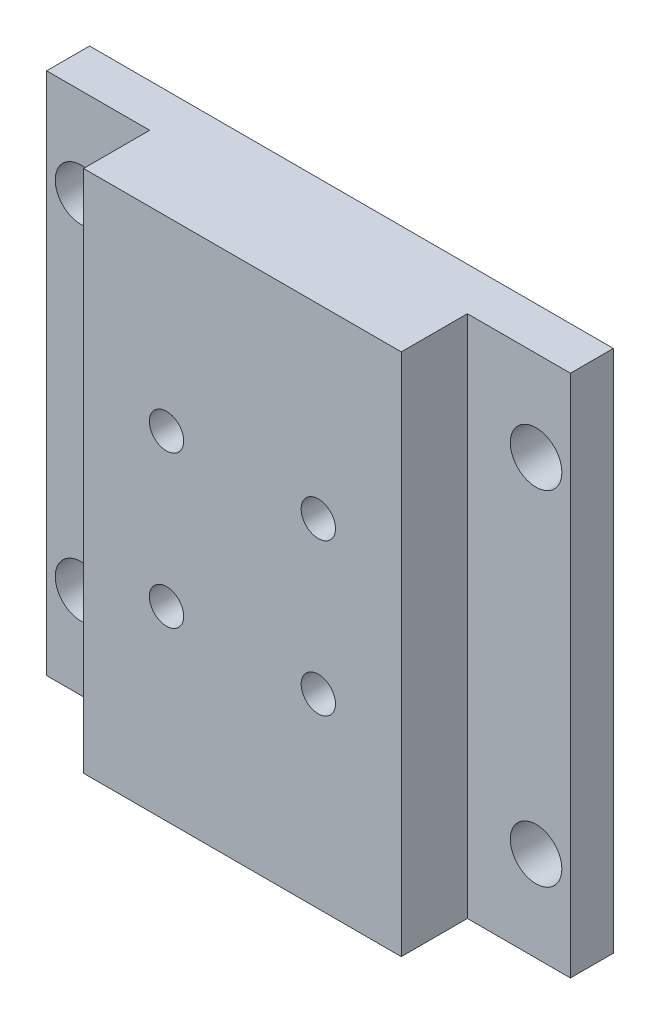
ISO-10303-21;
HEADER;
FILE_DESCRIPTION(('STEP AP214'),'2;1');
FILE_NAME('part.step','',(''),(''),'','','');
FILE_SCHEMA(('AUTOMOTIVE_DESIGN { 1 0 10303 214 1 1 1 1 }'));
ENDSEC;
DATA;
#1=APPLICATION_CONTEXT('core data for automotive mechanical design processes');
#2=APPLICATION_PROTOCOL_DEFINITION('international standard','automotive_design',2000,#1);
#3=PRODUCT_CONTEXT('',#1,'mechanical');
#4=PRODUCT('Part','Part','',(#3));
#5=PRODUCT_RELATED_PRODUCT_CATEGORY('part','',(#4));
#6=PRODUCT_DEFINITION_FORMATION('','',#4);
#7=PRODUCT_DEFINITION_CONTEXT('part definition',#1,'design');
#8=PRODUCT_DEFINITION('design','',#6,#7);
#9=PRODUCT_DEFINITION_SHAPE('','',#8);
#10=(LENGTH_UNIT() NAMED_UNIT(*) SI_UNIT(.MILLI.,.METRE.));
#11=(NAMED_UNIT(*) PLANE_ANGLE_UNIT() SI_UNIT($,.RADIAN.));
#12=(NAMED_UNIT(*) SI_UNIT($,.STERADIAN.) SOLID_ANGLE_UNIT());
#13=UNCERTAINTY_MEASURE_WITH_UNIT(LENGTH_MEASURE(1.E-05),#10,'distance_accuracy_value','');
#14=(GEOMETRIC_REPRESENTATION_CONTEXT(3) GLOBAL_UNCERTAINTY_ASSIGNED_CONTEXT((#13)) GLOBAL_UNIT_ASSIGNED_CONTEXT((#10,
#11,#12)) REPRESENTATION_CONTEXT('',''));
#15=CARTESIAN_POINT('',(0.,0.,0.));
#16=DIRECTION('',(0.,0.,1.));
#17=DIRECTION('',(1.,0.,0.));
#18=AXIS2_PLACEMENT_3D('',#15,#16,#17);
#19=CARTESIAN_POINT('',(30.5,30.5,-12.7));
#20=DIRECTION('',(1.,0.,0.));
#21=DIRECTION('',(0.,1.,0.));
#22=AXIS2_PLACEMENT_3D('',#19,#20,#21);
#23=PLANE('',#22);
#24=DIRECTION('',(0.,0.,1.));
#25=VECTOR('',#24,1.);
#26=CARTESIAN_POINT('',(30.5,30.5,-12.7));
#27=LINE('',#26,#25);
#28=CARTESIAN_POINT('',(30.5,30.5,-12.7));
#29=VERTEX_POINT('',#28);
#30=CARTESIAN_POINT('',(30.5,30.5,-7.7));
#31=VERTEX_POINT('',#30);
#32=EDGE_CURVE('E136',#29,#31,#27,.T.);
#33=ORIENTED_EDGE('',*,*,#32,.T.);
#34=DIRECTION('',(0.,-1.,0.));
#35=VECTOR('',#34,1.);
#36=CARTESIAN_POINT('',(30.5,-30.5,-7.7));
#37=LINE('',#36,#35);
#38=CARTESIAN_POINT('',(30.5,-30.5,-7.7));
#39=VERTEX_POINT('',#38);
#40=EDGE_CURVE('E107',#31,#39,#37,.T.);
#41=ORIENTED_EDGE('',*,*,#40,.T.);
#42=DIRECTION('',(0.,0.,1.));
#43=VECTOR('',#42,1.);
#44=CARTESIAN_POINT('',(30.5,-30.5,-12.7));
#45=LINE('',#44,#43);
#46=CARTESIAN_POINT('',(30.5,-30.5,-12.7));
#47=VERTEX_POINT('',#46);
#48=EDGE_CURVE('E12',#47,#39,#45,.T.);
#49=ORIENTED_EDGE('',*,*,#48,.F.);
#50=DIRECTION('',(0.,1.,0.));
#51=VECTOR('',#50,1.);
#52=CARTESIAN_POINT('',(30.5,30.5,-12.7));
#53=LINE('',#52,#51);
#54=EDGE_CURVE('E123',#47,#29,#53,.T.);
#55=ORIENTED_EDGE('',*,*,#54,.T.);
#56=EDGE_LOOP('',(#33,#41,#49,#55));
#57=FACE_BOUND('',#56,.T.);
#58=ADVANCED_FACE('F34',(#57),#23,.T.);
#59=CARTESIAN_POINT('',(-30.5,30.5,-12.7));
#60=DIRECTION('',(-1.,0.,0.));
#61=DIRECTION('',(0.,-1.,0.));
#62=AXIS2_PLACEMENT_3D('',#59,#60,#61);
#63=PLANE('',#62);
#64=DIRECTION('',(0.,0.,1.));
#65=VECTOR('',#64,1.);
#66=CARTESIAN_POINT('',(-30.5,-30.5,-12.7));
#67=LINE('',#66,#65);
#68=CARTESIAN_POINT('',(-30.5,-30.5,-12.7));
#69=VERTEX_POINT('',#68);
#70=CARTESIAN_POINT('',(-30.5,-30.5,-7.7));
#71=VERTEX_POINT('',#70);
#72=EDGE_CURVE('E42',#69,#71,#67,.T.);
#73=ORIENTED_EDGE('',*,*,#72,.T.);
#74=DIRECTION('',(0.,1.,0.));
#75=VECTOR('',#74,1.);
#76=CARTESIAN_POINT('',(-30.5,-30.5,-7.7));
#77=LINE('',#76,#75);
#78=CARTESIAN_POINT('',(-30.5,30.5,-7.7));
#79=VERTEX_POINT('',#78);
#80=EDGE_CURVE('E147',#71,#79,#77,.T.);
#81=ORIENTED_EDGE('',*,*,#80,.T.);
#82=DIRECTION('',(0.,0.,1.));
#83=VECTOR('',#82,1.);
#84=CARTESIAN_POINT('',(-30.5,30.5,-12.7));
#85=LINE('',#84,#83);
#86=CARTESIAN_POINT('',(-30.5,30.5,-12.7));
#87=VERTEX_POINT('',#86);
#88=EDGE_CURVE('E134',#87,#79,#85,.T.);
#89=ORIENTED_EDGE('',*,*,#88,.F.);
#90=DIRECTION('',(0.,-1.,0.));
#91=VECTOR('',#90,1.);
#92=CARTESIAN_POINT('',(-30.5,30.5,-12.7));
#93=LINE('',#92,#91);
#94=EDGE_CURVE('E209',#87,#69,#93,.T.);
#95=ORIENTED_EDGE('',*,*,#94,.T.);
#96=EDGE_LOOP('',(#73,#81,#89,#95));
#97=FACE_BOUND('',#96,.T.);
#98=ADVANCED_FACE('F224',(#97),#63,.T.);
#99=CARTESIAN_POINT('',(26.5,20.,-12.7));
#100=DIRECTION('',(0.,0.,1.));
#101=DIRECTION('',(1.,0.,0.));
#102=AXIS2_PLACEMENT_3D('',#99,#100,#101);
#103=CYLINDRICAL_SURFACE('',#102,3.);
#104=CARTESIAN_POINT('',(26.5,20.,-12.7));
#105=DIRECTION('',(0.,0.,1.));
#106=DIRECTION('',(1.,0.,0.));
#107=AXIS2_PLACEMENT_3D('',#104,#105,#106);
#108=CIRCLE('',#107,3.);
#109=CARTESIAN_POINT('',(29.5,20.,-12.7));
#110=VERTEX_POINT('',#109);
#111=EDGE_CURVE('E180',#110,#110,#108,.T.);
#112=ORIENTED_EDGE('',*,*,#111,.F.);
#113=EDGE_LOOP('',(#112));
#114=FACE_BOUND('',#113,.T.);
#115=CARTESIAN_POINT('',(26.5,20.,-7.7));
#116=DIRECTION('',(0.,0.,1.));
#117=DIRECTION('',(1.,0.,0.));
#118=AXIS2_PLACEMENT_3D('',#115,#116,#117);
#119=CIRCLE('',#118,3.);
#120=CARTESIAN_POINT('',(29.5,20.,-7.7));
#121=VERTEX_POINT('',#120);
#122=EDGE_CURVE('E140',#121,#121,#119,.F.);
#123=ORIENTED_EDGE('',*,*,#122,.F.);
#124=EDGE_LOOP('',(#123));
#125=FACE_BOUND('',#124,.T.);
#126=ADVANCED_FACE('F246',(#114,#125),#103,.F.);
#127=CARTESIAN_POINT('',(-26.5,-20.,-12.7));
#128=DIRECTION('',(0.,0.,1.));
#129=DIRECTION('',(1.,0.,0.));
#130=AXIS2_PLACEMENT_3D('',#127,#128,#129);
#131=CYLINDRICAL_SURFACE('',#130,3.);
#132=CARTESIAN_POINT('',(-26.5,-20.,-12.7));
#133=DIRECTION('',(0.,0.,1.));
#134=DIRECTION('',(1.,0.,0.));
#135=AXIS2_PLACEMENT_3D('',#132,#133,#134);
#136=CIRCLE('',#135,3.);
#137=CARTESIAN_POINT('',(-23.5,-20.,-12.7));
#138=VERTEX_POINT('',#137);
#139=EDGE_CURVE('E173',#138,#138,#136,.T.);
#140=ORIENTED_EDGE('',*,*,#139,.F.);
#141=EDGE_LOOP('',(#140));
#142=FACE_BOUND('',#141,.T.);
#143=CARTESIAN_POINT('',(-26.5,-20.,-7.7));
#144=DIRECTION('',(0.,0.,1.));
#145=DIRECTION('',(1.,0.,0.));
#146=AXIS2_PLACEMENT_3D('',#143,#144,#145);
#147=CIRCLE('',#146,3.);
#148=CARTESIAN_POINT('',(-23.5,-20.,-7.7));
#149=VERTEX_POINT('',#148);
#150=EDGE_CURVE('E170',#149,#149,#147,.F.);
#151=ORIENTED_EDGE('',*,*,#150,.F.);
#152=EDGE_LOOP('',(#151));
#153=FACE_BOUND('',#152,.T.);
#154=ADVANCED_FACE('F251',(#142,#153),#131,.F.);
#155=CARTESIAN_POINT('',(-26.5,20.,-12.7));
#156=DIRECTION('',(0.,0.,1.));
#157=DIRECTION('',(1.,0.,0.));
#158=AXIS2_PLACEMENT_3D('',#155,#156,#157);
#159=CYLINDRICAL_SURFACE('',#158,3.);
#160=CARTESIAN_POINT('',(-26.5,20.,-12.7));
#161=DIRECTION('',(0.,0.,1.));
#162=DIRECTION('',(1.,0.,0.));
#163=AXIS2_PLACEMENT_3D('',#160,#161,#162);
#164=CIRCLE('',#163,3.);
#165=CARTESIAN_POINT('',(-23.5,20.,-12.7));
#166=VERTEX_POINT('',#165);
#167=EDGE_CURVE('E176',#166,#166,#164,.T.);
#168=ORIENTED_EDGE('',*,*,#167,.F.);
#169=EDGE_LOOP('',(#168));
#170=FACE_BOUND('',#169,.T.);
#171=CARTESIAN_POINT('',(-26.5,20.,-7.7));
#172=DIRECTION('',(0.,0.,1.));
#173=DIRECTION('',(1.,0.,0.));
#174=AXIS2_PLACEMENT_3D('',#171,#172,#173);
#175=CIRCLE('',#174,3.);
#176=CARTESIAN_POINT('',(-23.5,20.,-7.7));
#177=VERTEX_POINT('',#176);
#178=EDGE_CURVE('E37',#177,#177,#175,.F.);
#179=ORIENTED_EDGE('',*,*,#178,.F.);
#180=EDGE_LOOP('',(#179));
#181=FACE_BOUND('',#180,.T.);
#182=ADVANCED_FACE('F267',(#170,#181),#159,.F.);
#183=CARTESIAN_POINT('',(26.5,-20.,-12.7));
#184=DIRECTION('',(0.,0.,1.));
#185=DIRECTION('',(1.,0.,0.));
#186=AXIS2_PLACEMENT_3D('',#183,#184,#185);
#187=CYLINDRICAL_SURFACE('',#186,3.);
#188=CARTESIAN_POINT('',(26.5,-20.,-12.7));
#189=DIRECTION('',(0.,0.,1.));
#190=DIRECTION('',(1.,0.,0.));
#191=AXIS2_PLACEMENT_3D('',#188,#189,#190);
#192=CIRCLE('',#191,3.);
#193=CARTESIAN_POINT('',(29.5,-20.,-12.7));
#194=VERTEX_POINT('',#193);
#195=EDGE_CURVE('E177',#194,#194,#192,.T.);
#196=ORIENTED_EDGE('',*,*,#195,.F.);
#197=EDGE_LOOP('',(#196));
#198=FACE_BOUND('',#197,.T.);
#199=CARTESIAN_POINT('',(26.5,-20.,-7.7));
#200=DIRECTION('',(0.,0.,1.));
#201=DIRECTION('',(1.,0.,0.));
#202=AXIS2_PLACEMENT_3D('',#199,#200,#201);
#203=CIRCLE('',#202,3.);
#204=CARTESIAN_POINT('',(29.5,-20.,-7.7));
#205=VERTEX_POINT('',#204);
#206=EDGE_CURVE('E138',#205,#205,#203,.F.);
#207=ORIENTED_EDGE('',*,*,#206,.F.);
#208=EDGE_LOOP('',(#207));
#209=FACE_BOUND('',#208,.T.);
#210=ADVANCED_FACE('F263',(#198,#209),#187,.F.);
#211=CARTESIAN_POINT('',(-30.5,-30.5,-12.7));
#212=DIRECTION('',(0.,-1.,0.));
#213=DIRECTION('',(0.,0.,-1.));
#214=AXIS2_PLACEMENT_3D('',#211,#212,#213);
#215=PLANE('',#214);
#216=DIRECTION('',(0.,0.,1.));
#217=VECTOR('',#216,1.);
#218=CARTESIAN_POINT('',(-18.5,-30.5,-74.8691241694782));
#219=LINE('',#218,#217);
#220=CARTESIAN_POINT('',(-18.5,-30.5,-7.7));
#221=VERTEX_POINT('',#220);
#222=CARTESIAN_POINT('',(-18.5,-30.5,0.));
#223=VERTEX_POINT('',#222);
#224=EDGE_CURVE('E50',#221,#223,#219,.T.);
#225=ORIENTED_EDGE('',*,*,#224,.F.);
#226=DIRECTION('',(-1.,0.,0.));
#227=VECTOR('',#226,1.);
#228=CARTESIAN_POINT('',(-18.5,-30.5,-7.7));
#229=LINE('',#228,#227);
#230=EDGE_CURVE('E141',#221,#71,#229,.T.);
#231=ORIENTED_EDGE('',*,*,#230,.T.);
#232=ORIENTED_EDGE('',*,*,#72,.F.);
#233=DIRECTION('',(1.,0.,0.));
#234=VECTOR('',#233,1.);
#235=CARTESIAN_POINT('',(-30.5,-30.5,-12.7));
#236=LINE('',#235,#234);
#237=EDGE_CURVE('E129',#69,#47,#236,.T.);
#238=ORIENTED_EDGE('',*,*,#237,.T.);
#239=ORIENTED_EDGE('',*,*,#48,.T.);
#240=DIRECTION('',(-1.,0.,0.));
#241=VECTOR('',#240,1.);
#242=CARTESIAN_POINT('',(18.5,-30.5,-7.7));
#243=LINE('',#242,#241);
#244=CARTESIAN_POINT('',(18.5,-30.5,-7.7));
#245=VERTEX_POINT('',#244);
#246=EDGE_CURVE('E161',#39,#245,#243,.T.);
#247=ORIENTED_EDGE('',*,*,#246,.T.);
#248=DIRECTION('',(0.,0.,1.));
#249=VECTOR('',#248,1.);
#250=CARTESIAN_POINT('',(18.5,-30.5,-74.8691241694782));
#251=LINE('',#250,#249);
#252=CARTESIAN_POINT('',(18.5,-30.5,0.));
#253=VERTEX_POINT('',#252);
#254=EDGE_CURVE('E159',#245,#253,#251,.T.);
#255=ORIENTED_EDGE('',*,*,#254,.T.);
#256=DIRECTION('',(1.,0.,0.));
#257=VECTOR('',#256,1.);
#258=CARTESIAN_POINT('',(-30.5,-30.5,0.));
#259=LINE('',#258,#257);
#260=EDGE_CURVE('E120',#223,#253,#259,.T.);
#261=ORIENTED_EDGE('',*,*,#260,.F.);
#262=EDGE_LOOP('',(#225,#231,#232,#238,#239,#247,#255,#261));
#263=FACE_BOUND('',#262,.T.);
#264=ADVANCED_FACE('F215',(#263),#215,.T.);
#265=CARTESIAN_POINT('',(-30.5,30.5,-12.7));
#266=DIRECTION('',(0.,1.,0.));
#267=DIRECTION('',(0.,0.,1.));
#268=AXIS2_PLACEMENT_3D('',#265,#266,#267);
#269=PLANE('',#268);
#270=DIRECTION('',(0.,0.,1.));
#271=VECTOR('',#270,1.);
#272=CARTESIAN_POINT('',(-18.5,30.5,-74.8691241694782));
#273=LINE('',#272,#271);
#274=CARTESIAN_POINT('',(-18.5,30.5,-7.7));
#275=VERTEX_POINT('',#274);
#276=CARTESIAN_POINT('',(-18.5,30.5,0.));
#277=VERTEX_POINT('',#276);
#278=EDGE_CURVE('E101',#275,#277,#273,.T.);
#279=ORIENTED_EDGE('',*,*,#278,.T.);
#280=DIRECTION('',(-1.,0.,0.));
#281=VECTOR('',#280,1.);
#282=CARTESIAN_POINT('',(-30.5,30.5,0.));
#283=LINE('',#282,#281);
#284=CARTESIAN_POINT('',(18.5,30.5,0.));
#285=VERTEX_POINT('',#284);
#286=EDGE_CURVE('E112',#285,#277,#283,.T.);
#287=ORIENTED_EDGE('',*,*,#286,.F.);
#288=DIRECTION('',(0.,0.,1.));
#289=VECTOR('',#288,1.);
#290=CARTESIAN_POINT('',(18.5,30.5,-74.8691241694782));
#291=LINE('',#290,#289);
#292=CARTESIAN_POINT('',(18.5,30.5,-7.7));
#293=VERTEX_POINT('',#292);
#294=EDGE_CURVE('E58',#293,#285,#291,.T.);
#295=ORIENTED_EDGE('',*,*,#294,.F.);
#296=DIRECTION('',(1.,0.,0.));
#297=VECTOR('',#296,1.);
#298=CARTESIAN_POINT('',(30.5,30.5,-7.7));
#299=LINE('',#298,#297);
#300=EDGE_CURVE('E155',#293,#31,#299,.T.);
#301=ORIENTED_EDGE('',*,*,#300,.T.);
#302=ORIENTED_EDGE('',*,*,#32,.F.);
#303=DIRECTION('',(-1.,0.,0.));
#304=VECTOR('',#303,1.);
#305=CARTESIAN_POINT('',(-30.5,30.5,-12.7));
#306=LINE('',#305,#304);
#307=EDGE_CURVE('E207',#29,#87,#306,.T.);
#308=ORIENTED_EDGE('',*,*,#307,.T.);
#309=ORIENTED_EDGE('',*,*,#88,.T.);
#310=DIRECTION('',(1.,0.,0.));
#311=VECTOR('',#310,1.);
#312=CARTESIAN_POINT('',(-30.5,30.5,-7.7));
#313=LINE('',#312,#311);
#314=EDGE_CURVE('E114',#79,#275,#313,.T.);
#315=ORIENTED_EDGE('',*,*,#314,.T.);
#316=EDGE_LOOP('',(#279,#287,#295,#301,#302,#308,#309,#315));
#317=FACE_BOUND('',#316,.T.);
#318=ADVANCED_FACE('F111',(#317),#269,.T.);
#319=CARTESIAN_POINT('',(0.,0.,-12.7));
#320=DIRECTION('',(0.,0.,1.));
#321=DIRECTION('',(1.,0.,0.));
#322=AXIS2_PLACEMENT_3D('',#319,#320,#321);
#323=PLANE('',#322);
#324=ORIENTED_EDGE('',*,*,#195,.T.);
#325=EDGE_LOOP('',(#324));
#326=FACE_BOUND('',#325,.T.);
#327=ORIENTED_EDGE('',*,*,#167,.T.);
#328=EDGE_LOOP('',(#327));
#329=FACE_BOUND('',#328,.T.);
#330=ORIENTED_EDGE('',*,*,#139,.T.);
#331=EDGE_LOOP('',(#330));
#332=FACE_BOUND('',#331,.T.);
#333=ORIENTED_EDGE('',*,*,#111,.T.);
#334=EDGE_LOOP('',(#333));
#335=FACE_BOUND('',#334,.T.);
#336=CARTESIAN_POINT('',(8.83883476483184,-8.83883476483184,-12.7));
#337=DIRECTION('',(0.,0.,1.));
#338=DIRECTION('',(1.,0.,0.));
#339=AXIS2_PLACEMENT_3D('',#336,#337,#338);
#340=CIRCLE('',#339,2.);
#341=CARTESIAN_POINT('',(10.8388347648318,-8.83883476483184,-12.7));
#342=VERTEX_POINT('',#341);
#343=EDGE_CURVE('E198',#342,#342,#340,.T.);
#344=ORIENTED_EDGE('',*,*,#343,.T.);
#345=EDGE_LOOP('',(#344));
#346=FACE_BOUND('',#345,.T.);
#347=CARTESIAN_POINT('',(-8.83883476483184,-8.83883476483184,-12.7));
#348=DIRECTION('',(0.,0.,1.));
#349=DIRECTION('',(1.,0.,0.));
#350=AXIS2_PLACEMENT_3D('',#347,#348,#349);
#351=CIRCLE('',#350,2.);
#352=CARTESIAN_POINT('',(-6.83883476483184,-8.83883476483184,-12.7));
#353=VERTEX_POINT('',#352);
#354=EDGE_CURVE('E192',#353,#353,#351,.T.);
#355=ORIENTED_EDGE('',*,*,#354,.T.);
#356=EDGE_LOOP('',(#355));
#357=FACE_BOUND('',#356,.T.);
#358=CARTESIAN_POINT('',(-8.83883476483185,8.83883476483184,-12.7));
#359=DIRECTION('',(0.,0.,1.));
#360=DIRECTION('',(1.,0.,0.));
#361=AXIS2_PLACEMENT_3D('',#358,#359,#360);
#362=CIRCLE('',#361,2.);
#363=CARTESIAN_POINT('',(-6.83883476483185,8.83883476483184,-12.7));
#364=VERTEX_POINT('',#363);
#365=EDGE_CURVE('E186',#364,#364,#362,.T.);
#366=ORIENTED_EDGE('',*,*,#365,.T.);
#367=EDGE_LOOP('',(#366));
#368=FACE_BOUND('',#367,.T.);
#369=CARTESIAN_POINT('',(8.83883476483184,8.83883476483184,-12.7));
#370=DIRECTION('',(0.,0.,1.));
#371=DIRECTION('',(1.,0.,0.));
#372=AXIS2_PLACEMENT_3D('',#369,#370,#371);
#373=CIRCLE('',#372,2.);
#374=CARTESIAN_POINT('',(10.8388347648318,8.83883476483184,-12.7));
#375=VERTEX_POINT('',#374);
#376=EDGE_CURVE('E121',#375,#375,#373,.T.);
#377=ORIENTED_EDGE('',*,*,#376,.T.);
#378=EDGE_LOOP('',(#377));
#379=FACE_BOUND('',#378,.T.);
#380=ORIENTED_EDGE('',*,*,#54,.F.);
#381=ORIENTED_EDGE('',*,*,#237,.F.);
#382=ORIENTED_EDGE('',*,*,#94,.F.);
#383=ORIENTED_EDGE('',*,*,#307,.F.);
#384=EDGE_LOOP('',(#380,#381,#382,#383));
#385=FACE_BOUND('',#384,.T.);
#386=ADVANCED_FACE('F218',(#326,#329,#332,#335,#346,#357,#368,#379,#385),#323,.F.);
#387=CARTESIAN_POINT('',(0.,0.,0.));
#388=DIRECTION('',(0.,0.,1.));
#389=DIRECTION('',(1.,0.,0.));
#390=AXIS2_PLACEMENT_3D('',#387,#388,#389);
#391=PLANE('',#390);
#392=DIRECTION('',(0.,1.,0.));
#393=VECTOR('',#392,1.);
#394=CARTESIAN_POINT('',(-18.5,30.5,0.));
#395=LINE('',#394,#393);
#396=EDGE_CURVE('E98',#223,#277,#395,.T.);
#397=ORIENTED_EDGE('',*,*,#396,.F.);
#398=ORIENTED_EDGE('',*,*,#260,.T.);
#399=DIRECTION('',(0.,-1.,0.));
#400=VECTOR('',#399,1.);
#401=CARTESIAN_POINT('',(18.5,30.5,0.));
#402=LINE('',#401,#400);
#403=EDGE_CURVE('E119',#285,#253,#402,.T.);
#404=ORIENTED_EDGE('',*,*,#403,.F.);
#405=ORIENTED_EDGE('',*,*,#286,.T.);
#406=EDGE_LOOP('',(#397,#398,#404,#405));
#407=FACE_BOUND('',#406,.T.);
#408=CARTESIAN_POINT('',(8.83883476483184,-8.83883476483184,0.));
#409=DIRECTION('',(0.,0.,1.));
#410=DIRECTION('',(1.,0.,0.));
#411=AXIS2_PLACEMENT_3D('',#408,#409,#410);
#412=CIRCLE('',#411,2.);
#413=CARTESIAN_POINT('',(10.8388347648318,-8.83883476483184,0.));
#414=VERTEX_POINT('',#413);
#415=EDGE_CURVE('E185',#414,#414,#412,.T.);
#416=ORIENTED_EDGE('',*,*,#415,.F.);
#417=EDGE_LOOP('',(#416));
#418=FACE_BOUND('',#417,.T.);
#419=CARTESIAN_POINT('',(-8.83883476483184,-8.83883476483184,0.));
#420=DIRECTION('',(0.,0.,1.));
#421=DIRECTION('',(1.,0.,0.));
#422=AXIS2_PLACEMENT_3D('',#419,#420,#421);
#423=CIRCLE('',#422,2.);
#424=CARTESIAN_POINT('',(-6.83883476483184,-8.83883476483184,0.));
#425=VERTEX_POINT('',#424);
#426=EDGE_CURVE('E195',#425,#425,#423,.T.);
#427=ORIENTED_EDGE('',*,*,#426,.F.);
#428=EDGE_LOOP('',(#427));
#429=FACE_BOUND('',#428,.T.);
#430=CARTESIAN_POINT('',(-8.83883476483185,8.83883476483184,0.));
#431=DIRECTION('',(0.,0.,1.));
#432=DIRECTION('',(1.,0.,0.));
#433=AXIS2_PLACEMENT_3D('',#430,#431,#432);
#434=CIRCLE('',#433,2.);
#435=CARTESIAN_POINT('',(-6.83883476483185,8.83883476483184,0.));
#436=VERTEX_POINT('',#435);
#437=EDGE_CURVE('E189',#436,#436,#434,.T.);
#438=ORIENTED_EDGE('',*,*,#437,.F.);
#439=EDGE_LOOP('',(#438));
#440=FACE_BOUND('',#439,.T.);
#441=CARTESIAN_POINT('',(8.83883476483184,8.83883476483184,0.));
#442=DIRECTION('',(0.,0.,1.));
#443=DIRECTION('',(1.,0.,0.));
#444=AXIS2_PLACEMENT_3D('',#441,#442,#443);
#445=CIRCLE('',#444,2.);
#446=CARTESIAN_POINT('',(10.8388347648318,8.83883476483184,0.));
#447=VERTEX_POINT('',#446);
#448=EDGE_CURVE('E126',#447,#447,#445,.T.);
#449=ORIENTED_EDGE('',*,*,#448,.F.);
#450=EDGE_LOOP('',(#449));
#451=FACE_BOUND('',#450,.T.);
#452=ADVANCED_FACE('F117',(#407,#418,#429,#440,#451),#391,.T.);
#453=CARTESIAN_POINT('',(8.83883476483184,8.83883476483184,-12.7));
#454=DIRECTION('',(0.,0.,1.));
#455=DIRECTION('',(1.,0.,0.));
#456=AXIS2_PLACEMENT_3D('',#453,#454,#455);
#457=CYLINDRICAL_SURFACE('',#456,2.);
#458=ORIENTED_EDGE('',*,*,#376,.F.);
#459=EDGE_LOOP('',(#458));
#460=FACE_BOUND('',#459,.T.);
#461=ORIENTED_EDGE('',*,*,#448,.T.);
#462=EDGE_LOOP('',(#461));
#463=FACE_BOUND('',#462,.T.);
#464=ADVANCED_FACE('F282',(#460,#463),#457,.F.);
#465=CARTESIAN_POINT('',(-8.83883476483185,8.83883476483184,-12.7));
#466=DIRECTION('',(0.,0.,1.));
#467=DIRECTION('',(1.,0.,0.));
#468=AXIS2_PLACEMENT_3D('',#465,#466,#467);
#469=CYLINDRICAL_SURFACE('',#468,2.);
#470=ORIENTED_EDGE('',*,*,#365,.F.);
#471=EDGE_LOOP('',(#470));
#472=FACE_BOUND('',#471,.T.);
#473=ORIENTED_EDGE('',*,*,#437,.T.);
#474=EDGE_LOOP('',(#473));
#475=FACE_BOUND('',#474,.T.);
#476=ADVANCED_FACE('F278',(#472,#475),#469,.F.);
#477=CARTESIAN_POINT('',(-8.83883476483184,-8.83883476483184,-12.7));
#478=DIRECTION('',(0.,0.,1.));
#479=DIRECTION('',(1.,0.,0.));
#480=AXIS2_PLACEMENT_3D('',#477,#478,#479);
#481=CYLINDRICAL_SURFACE('',#480,2.);
#482=ORIENTED_EDGE('',*,*,#354,.F.);
#483=EDGE_LOOP('',(#482));
#484=FACE_BOUND('',#483,.T.);
#485=ORIENTED_EDGE('',*,*,#426,.T.);
#486=EDGE_LOOP('',(#485));
#487=FACE_BOUND('',#486,.T.);
#488=ADVANCED_FACE('F281',(#484,#487),#481,.F.);
#489=CARTESIAN_POINT('',(8.83883476483184,-8.83883476483184,-12.7));
#490=DIRECTION('',(0.,0.,1.));
#491=DIRECTION('',(1.,0.,0.));
#492=AXIS2_PLACEMENT_3D('',#489,#490,#491);
#493=CYLINDRICAL_SURFACE('',#492,2.);
#494=ORIENTED_EDGE('',*,*,#343,.F.);
#495=EDGE_LOOP('',(#494));
#496=FACE_BOUND('',#495,.T.);
#497=ORIENTED_EDGE('',*,*,#415,.T.);
#498=EDGE_LOOP('',(#497));
#499=FACE_BOUND('',#498,.T.);
#500=ADVANCED_FACE('F239',(#496,#499),#493,.F.);
#501=CARTESIAN_POINT('',(0.,0.,-7.7));
#502=DIRECTION('',(0.,0.,1.));
#503=DIRECTION('',(1.,0.,0.));
#504=AXIS2_PLACEMENT_3D('',#501,#502,#503);
#505=PLANE('',#504);
#506=ORIENTED_EDGE('',*,*,#246,.F.);
#507=ORIENTED_EDGE('',*,*,#40,.F.);
#508=ORIENTED_EDGE('',*,*,#300,.F.);
#509=DIRECTION('',(0.,1.,0.));
#510=VECTOR('',#509,1.);
#511=CARTESIAN_POINT('',(18.5,30.5,-7.7));
#512=LINE('',#511,#510);
#513=EDGE_CURVE('E158',#245,#293,#512,.T.);
#514=ORIENTED_EDGE('',*,*,#513,.F.);
#515=EDGE_LOOP('',(#506,#507,#508,#514));
#516=FACE_BOUND('',#515,.T.);
#517=ORIENTED_EDGE('',*,*,#206,.T.);
#518=EDGE_LOOP('',(#517));
#519=FACE_BOUND('',#518,.T.);
#520=ORIENTED_EDGE('',*,*,#122,.T.);
#521=EDGE_LOOP('',(#520));
#522=FACE_BOUND('',#521,.T.);
#523=ADVANCED_FACE('F223',(#516,#519,#522),#505,.T.);
#524=CARTESIAN_POINT('',(18.5,30.5,-74.8691241694782));
#525=DIRECTION('',(-1.,0.,0.));
#526=DIRECTION('',(0.,-1.,0.));
#527=AXIS2_PLACEMENT_3D('',#524,#525,#526);
#528=PLANE('',#527);
#529=ORIENTED_EDGE('',*,*,#513,.T.);
#530=ORIENTED_EDGE('',*,*,#294,.T.);
#531=ORIENTED_EDGE('',*,*,#403,.T.);
#532=ORIENTED_EDGE('',*,*,#254,.F.);
#533=EDGE_LOOP('',(#529,#530,#531,#532));
#534=FACE_BOUND('',#533,.T.);
#535=ADVANCED_FACE('F231',(#534),#528,.F.);
#536=CARTESIAN_POINT('',(0.,0.,-7.7));
#537=DIRECTION('',(0.,0.,1.));
#538=DIRECTION('',(1.,0.,0.));
#539=AXIS2_PLACEMENT_3D('',#536,#537,#538);
#540=PLANE('',#539);
#541=ORIENTED_EDGE('',*,*,#80,.F.);
#542=ORIENTED_EDGE('',*,*,#230,.F.);
#543=DIRECTION('',(0.,-1.,0.));
#544=VECTOR('',#543,1.);
#545=CARTESIAN_POINT('',(-18.5,30.5,-7.7));
#546=LINE('',#545,#544);
#547=EDGE_CURVE('E115',#275,#221,#546,.T.);
#548=ORIENTED_EDGE('',*,*,#547,.F.);
#549=ORIENTED_EDGE('',*,*,#314,.F.);
#550=EDGE_LOOP('',(#541,#542,#548,#549));
#551=FACE_BOUND('',#550,.T.);
#552=ORIENTED_EDGE('',*,*,#178,.T.);
#553=EDGE_LOOP('',(#552));
#554=FACE_BOUND('',#553,.T.);
#555=ORIENTED_EDGE('',*,*,#150,.T.);
#556=EDGE_LOOP('',(#555));
#557=FACE_BOUND('',#556,.T.);
#558=ADVANCED_FACE('F226',(#551,#554,#557),#540,.T.);
#559=CARTESIAN_POINT('',(-18.5,30.5,-74.8691241694782));
#560=DIRECTION('',(1.,0.,0.));
#561=DIRECTION('',(0.,1.,0.));
#562=AXIS2_PLACEMENT_3D('',#559,#560,#561);
#563=PLANE('',#562);
#564=ORIENTED_EDGE('',*,*,#547,.T.);
#565=ORIENTED_EDGE('',*,*,#224,.T.);
#566=ORIENTED_EDGE('',*,*,#396,.T.);
#567=ORIENTED_EDGE('',*,*,#278,.F.);
#568=EDGE_LOOP('',(#564,#565,#566,#567));
#569=FACE_BOUND('',#568,.T.);
#570=ADVANCED_FACE('F100',(#569),#563,.F.);
#571=CLOSED_SHELL('',(#58,#98,#126,#154,#182,#210,#264,#318,#386,#452,#464,#476,#488,#500,#523,
#535,#558,#570));
#572=MANIFOLD_SOLID_BREP('B2',#571);
#573=ADVANCED_BREP_SHAPE_REPRESENTATION('',(#18,#572),#14);
#574=SHAPE_DEFINITION_REPRESENTATION(#9,#573);
ENDSEC;
END-ISO-10303-21;
